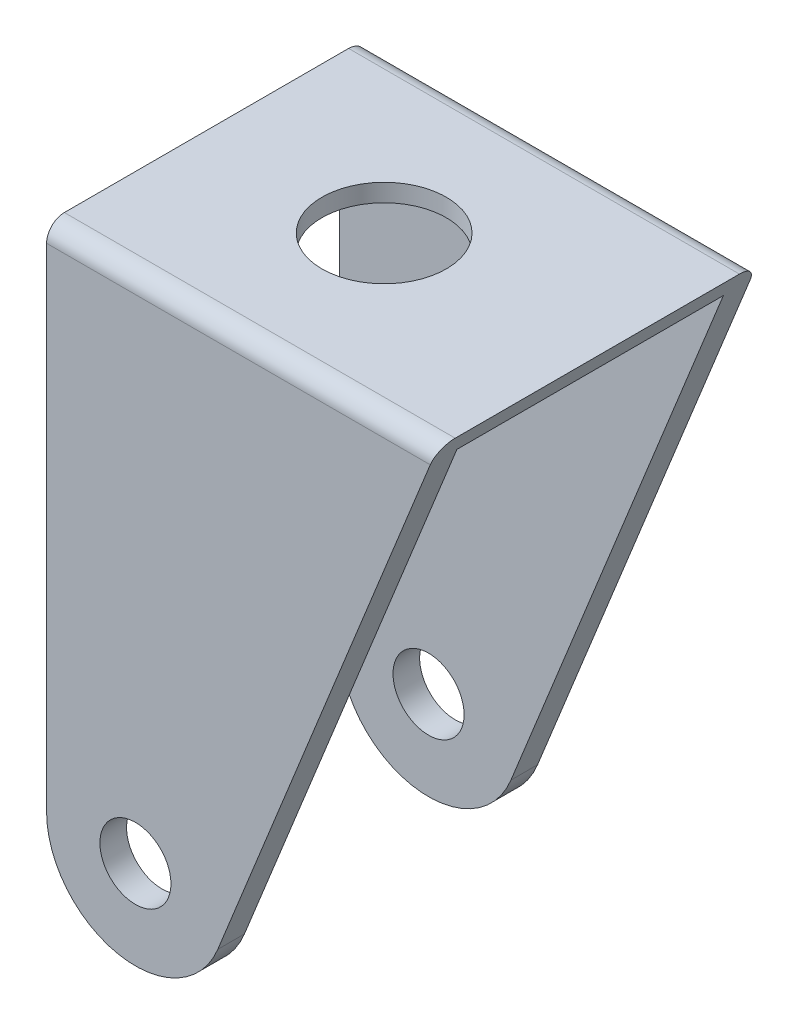
ISO-10303-21;
HEADER;
FILE_DESCRIPTION(('STEP AP214'),'2;1');
FILE_NAME('part.step','',(''),(''),'','','');
FILE_SCHEMA(('AUTOMOTIVE_DESIGN { 1 0 10303 214 1 1 1 1 }'));
ENDSEC;
DATA;
#1=APPLICATION_CONTEXT('core data for automotive mechanical design processes');
#2=APPLICATION_PROTOCOL_DEFINITION('international standard','automotive_design',2000,#1);
#3=PRODUCT_CONTEXT('',#1,'mechanical');
#4=PRODUCT('Part','Part','',(#3));
#5=PRODUCT_RELATED_PRODUCT_CATEGORY('part','',(#4));
#6=PRODUCT_DEFINITION_FORMATION('','',#4);
#7=PRODUCT_DEFINITION_CONTEXT('part definition',#1,'design');
#8=PRODUCT_DEFINITION('design','',#6,#7);
#9=PRODUCT_DEFINITION_SHAPE('','',#8);
#10=(LENGTH_UNIT() NAMED_UNIT(*) SI_UNIT(.MILLI.,.METRE.));
#11=(NAMED_UNIT(*) PLANE_ANGLE_UNIT() SI_UNIT($,.RADIAN.));
#12=(NAMED_UNIT(*) SI_UNIT($,.STERADIAN.) SOLID_ANGLE_UNIT());
#13=UNCERTAINTY_MEASURE_WITH_UNIT(LENGTH_MEASURE(1.E-05),#10,'distance_accuracy_value','');
#14=(GEOMETRIC_REPRESENTATION_CONTEXT(3) GLOBAL_UNCERTAINTY_ASSIGNED_CONTEXT((#13)) GLOBAL_UNIT_ASSIGNED_CONTEXT((#10,
#11,#12)) REPRESENTATION_CONTEXT('',''));
#15=CARTESIAN_POINT('',(0.,0.,0.));
#16=DIRECTION('',(0.,0.,1.));
#17=DIRECTION('',(1.,0.,0.));
#18=AXIS2_PLACEMENT_3D('',#15,#16,#17);
#19=CARTESIAN_POINT('',(-22.,34.9431156058949,18.));
#20=DIRECTION('',(0.,-1.,0.));
#21=DIRECTION('',(0.,0.,-1.));
#22=AXIS2_PLACEMENT_3D('',#19,#20,#21);
#23=PLANE('',#22);
#24=DIRECTION('',(0.,0.,-1.));
#25=VECTOR('',#24,1.);
#26=CARTESIAN_POINT('',(-22.,34.9431156058949,18.));
#27=LINE('',#26,#25);
#28=CARTESIAN_POINT('',(-22.,34.9431156058949,16.));
#29=VERTEX_POINT('',#28);
#30=CARTESIAN_POINT('',(-22.,34.9431156058949,-16.));
#31=VERTEX_POINT('',#30);
#32=EDGE_CURVE('E141',#29,#31,#27,.T.);
#33=ORIENTED_EDGE('',*,*,#32,.F.);
#34=DIRECTION('',(-1.,0.,0.));
#35=VECTOR('',#34,1.);
#36=CARTESIAN_POINT('',(-22.,34.9431156058949,16.));
#37=LINE('',#36,#35);
#38=CARTESIAN_POINT('',(22.,34.9431156058949,16.));
#39=VERTEX_POINT('',#38);
#40=EDGE_CURVE('E166',#29,#39,#37,.F.);
#41=ORIENTED_EDGE('',*,*,#40,.T.);
#42=DIRECTION('',(0.,0.,-1.));
#43=VECTOR('',#42,1.);
#44=CARTESIAN_POINT('',(22.,34.9431156058949,18.));
#45=LINE('',#44,#43);
#46=CARTESIAN_POINT('',(22.,34.9431156058949,-16.));
#47=VERTEX_POINT('',#46);
#48=EDGE_CURVE('E137',#39,#47,#45,.T.);
#49=ORIENTED_EDGE('',*,*,#48,.T.);
#50=DIRECTION('',(-1.,0.,0.));
#51=VECTOR('',#50,1.);
#52=CARTESIAN_POINT('',(-22.,34.9431156058949,-16.));
#53=LINE('',#52,#51);
#54=EDGE_CURVE('E163',#47,#31,#53,.T.);
#55=ORIENTED_EDGE('',*,*,#54,.T.);
#56=EDGE_LOOP('',(#33,#41,#49,#55));
#57=FACE_BOUND('',#56,.T.);
#58=CARTESIAN_POINT('',(-2.,34.9431156058949,0.));
#59=DIRECTION('',(0.,1.,0.));
#60=DIRECTION('',(0.,0.,1.));
#61=AXIS2_PLACEMENT_3D('',#58,#59,#60);
#62=CIRCLE('',#61,6.99999999999999);
#63=CARTESIAN_POINT('',(-2.,34.9431156058949,6.99999999999999));
#64=VERTEX_POINT('',#63);
#65=EDGE_CURVE('E223',#64,#64,#62,.T.);
#66=ORIENTED_EDGE('',*,*,#65,.F.);
#67=EDGE_LOOP('',(#66));
#68=FACE_BOUND('',#67,.T.);
#69=ADVANCED_FACE('F33',(#57,#68),#23,.F.);
#70=CARTESIAN_POINT('',(-22.,-22.5151657847201,18.));
#71=DIRECTION('',(1.,0.,0.));
#72=DIRECTION('',(0.,0.,-1.));
#73=AXIS2_PLACEMENT_3D('',#70,#71,#72);
#74=PLANE('',#73);
#75=DIRECTION('',(0.,-1.,0.));
#76=VECTOR('',#75,1.);
#77=CARTESIAN_POINT('',(-22.,-22.5151657847201,18.));
#78=LINE('',#77,#76);
#79=CARTESIAN_POINT('',(-22.,32.9431156058949,18.));
#80=VERTEX_POINT('',#79);
#81=CARTESIAN_POINT('',(-22.,-22.5151657847201,18.));
#82=VERTEX_POINT('',#81);
#83=EDGE_CURVE('E189',#80,#82,#78,.T.);
#84=ORIENTED_EDGE('',*,*,#83,.F.);
#85=CARTESIAN_POINT('',(-22.,32.9431156058949,16.));
#86=DIRECTION('',(1.,0.,0.));
#87=DIRECTION('',(0.,0.,-1.));
#88=AXIS2_PLACEMENT_3D('',#85,#86,#87);
#89=CIRCLE('',#88,2.);
#90=EDGE_CURVE('E161',#80,#29,#89,.F.);
#91=ORIENTED_EDGE('',*,*,#90,.T.);
#92=ORIENTED_EDGE('',*,*,#32,.T.);
#93=CARTESIAN_POINT('',(-22.,32.9431156058949,-16.));
#94=DIRECTION('',(1.,0.,0.));
#95=DIRECTION('',(0.,0.,-1.));
#96=AXIS2_PLACEMENT_3D('',#93,#94,#95);
#97=CIRCLE('',#96,2.);
#98=CARTESIAN_POINT('',(-22.,32.9431156058949,-18.));
#99=VERTEX_POINT('',#98);
#100=EDGE_CURVE('E159',#31,#99,#97,.F.);
#101=ORIENTED_EDGE('',*,*,#100,.T.);
#102=DIRECTION('',(0.,-1.,0.));
#103=VECTOR('',#102,1.);
#104=CARTESIAN_POINT('',(-22.,-22.5151657847201,-18.));
#105=LINE('',#104,#103);
#106=CARTESIAN_POINT('',(-22.,-22.5151657847201,-18.));
#107=VERTEX_POINT('',#106);
#108=EDGE_CURVE('E197',#99,#107,#105,.T.);
#109=ORIENTED_EDGE('',*,*,#108,.T.);
#110=DIRECTION('',(0.,0.,-1.));
#111=VECTOR('',#110,1.);
#112=CARTESIAN_POINT('',(-22.,-22.5151657847201,18.));
#113=LINE('',#112,#111);
#114=CARTESIAN_POINT('',(-22.,-22.5151657847201,-15.));
#115=VERTEX_POINT('',#114);
#116=EDGE_CURVE('E140',#115,#107,#113,.T.);
#117=ORIENTED_EDGE('',*,*,#116,.F.);
#118=DIRECTION('',(0.,-1.,0.));
#119=VECTOR('',#118,1.);
#120=CARTESIAN_POINT('',(-22.,32.9431156058949,-15.));
#121=LINE('',#120,#119);
#122=CARTESIAN_POINT('',(-22.,32.9431156058949,-15.));
#123=VERTEX_POINT('',#122);
#124=EDGE_CURVE('E118',#123,#115,#121,.T.);
#125=ORIENTED_EDGE('',*,*,#124,.F.);
#126=DIRECTION('',(0.,0.,1.));
#127=VECTOR('',#126,1.);
#128=CARTESIAN_POINT('',(-22.,32.9431156058949,-15.));
#129=LINE('',#128,#127);
#130=CARTESIAN_POINT('',(-22.,32.9431156058949,15.));
#131=VERTEX_POINT('',#130);
#132=EDGE_CURVE('E153',#123,#131,#129,.T.);
#133=ORIENTED_EDGE('',*,*,#132,.T.);
#134=DIRECTION('',(0.,-1.,0.));
#135=VECTOR('',#134,1.);
#136=CARTESIAN_POINT('',(-22.,32.9431156058949,15.));
#137=LINE('',#136,#135);
#138=CARTESIAN_POINT('',(-22.,-22.5151657847201,15.));
#139=VERTEX_POINT('',#138);
#140=EDGE_CURVE('E123',#131,#139,#137,.T.);
#141=ORIENTED_EDGE('',*,*,#140,.T.);
#142=EDGE_CURVE('E145',#82,#139,#113,.T.);
#143=ORIENTED_EDGE('',*,*,#142,.F.);
#144=EDGE_LOOP('',(#84,#91,#92,#101,#109,#117,#125,#133,#141,#143));
#145=FACE_BOUND('',#144,.T.);
#146=ADVANCED_FACE('F187',(#145),#74,.F.);
#147=CARTESIAN_POINT('',(-12.,-22.5151657847201,18.));
#148=DIRECTION('',(0.,0.,-1.));
#149=DIRECTION('',(-1.,0.,0.));
#150=AXIS2_PLACEMENT_3D('',#147,#148,#149);
#151=CYLINDRICAL_SURFACE('',#150,10.);
#152=CARTESIAN_POINT('',(-12.,-22.5151657847201,-15.));
#153=DIRECTION('',(0.,0.,1.));
#154=DIRECTION('',(1.,0.,0.));
#155=AXIS2_PLACEMENT_3D('',#152,#153,#154);
#156=CIRCLE('',#155,10.);
#157=CARTESIAN_POINT('',(-2.7281614543321,-26.2612317188791,-15.));
#158=VERTEX_POINT('',#157);
#159=EDGE_CURVE('E111',#115,#158,#156,.T.);
#160=ORIENTED_EDGE('',*,*,#159,.F.);
#161=ORIENTED_EDGE('',*,*,#116,.T.);
#162=CARTESIAN_POINT('',(-12.,-22.5151657847201,-18.));
#163=DIRECTION('',(0.,0.,1.));
#164=DIRECTION('',(-1.,0.,0.));
#165=AXIS2_PLACEMENT_3D('',#162,#163,#164);
#166=CIRCLE('',#165,10.);
#167=CARTESIAN_POINT('',(-2.7281614543321,-26.2612317188791,-18.));
#168=VERTEX_POINT('',#167);
#169=EDGE_CURVE('E135',#107,#168,#166,.T.);
#170=ORIENTED_EDGE('',*,*,#169,.T.);
#171=DIRECTION('',(0.,0.,-1.));
#172=VECTOR('',#171,1.);
#173=CARTESIAN_POINT('',(-2.7281614543321,-26.2612317188791,18.));
#174=LINE('',#173,#172);
#175=EDGE_CURVE('E126',#158,#168,#174,.T.);
#176=ORIENTED_EDGE('',*,*,#175,.F.);
#177=EDGE_LOOP('',(#160,#161,#170,#176));
#178=FACE_BOUND('',#177,.T.);
#179=ADVANCED_FACE('F133',(#178),#151,.T.);
#180=CARTESIAN_POINT('',(22.,34.9431156058949,18.));
#181=DIRECTION('',(-0.92718385456679,0.374606593415906,0.));
#182=DIRECTION('',(-0.374606593415906,-0.92718385456679,0.));
#183=AXIS2_PLACEMENT_3D('',#180,#181,#182);
#184=PLANE('',#183);
#185=ORIENTED_EDGE('',*,*,#48,.F.);
#186=CARTESIAN_POINT('',(21.1919475483297,32.9431156058949,16.));
#187=DIRECTION('',(-0.92718385456679,0.374606593415906,0.));
#188=DIRECTION('',(-0.374606593415906,-0.92718385456679,0.));
#189=AXIS2_PLACEMENT_3D('',#186,#187,#188);
#190=ELLIPSE('',#189,2.15706948535516,2.);
#191=CARTESIAN_POINT('',(21.1919475483297,32.9431156058949,18.));
#192=VERTEX_POINT('',#191);
#193=EDGE_CURVE('E41',#39,#192,#190,.F.);
#194=ORIENTED_EDGE('',*,*,#193,.T.);
#195=DIRECTION('',(0.374606593415906,0.92718385456679,0.));
#196=VECTOR('',#195,1.);
#197=CARTESIAN_POINT('',(22.,34.9431156058949,18.));
#198=LINE('',#197,#196);
#199=CARTESIAN_POINT('',(-2.7281614543321,-26.2612317188791,18.));
#200=VERTEX_POINT('',#199);
#201=EDGE_CURVE('E171',#200,#192,#198,.T.);
#202=ORIENTED_EDGE('',*,*,#201,.F.);
#203=CARTESIAN_POINT('',(-2.7281614543321,-26.2612317188791,15.));
#204=VERTEX_POINT('',#203);
#205=EDGE_CURVE('E136',#200,#204,#174,.T.);
#206=ORIENTED_EDGE('',*,*,#205,.T.);
#207=DIRECTION('',(0.374606593415906,0.92718385456679,0.));
#208=VECTOR('',#207,1.);
#209=CARTESIAN_POINT('',(-2.7281614543321,-26.2612317188791,15.));
#210=LINE('',#209,#208);
#211=CARTESIAN_POINT('',(21.1919475483297,32.9431156058949,15.));
#212=VERTEX_POINT('',#211);
#213=EDGE_CURVE('E213',#204,#212,#210,.T.);
#214=ORIENTED_EDGE('',*,*,#213,.T.);
#215=DIRECTION('',(0.,0.,1.));
#216=VECTOR('',#215,1.);
#217=CARTESIAN_POINT('',(21.1919475483297,32.9431156058949,-15.));
#218=LINE('',#217,#216);
#219=CARTESIAN_POINT('',(21.1919475483297,32.9431156058949,-15.));
#220=VERTEX_POINT('',#219);
#221=EDGE_CURVE('E130',#220,#212,#218,.T.);
#222=ORIENTED_EDGE('',*,*,#221,.F.);
#223=DIRECTION('',(0.374606593415906,0.92718385456679,0.));
#224=VECTOR('',#223,1.);
#225=CARTESIAN_POINT('',(-2.7281614543321,-26.2612317188791,-15.));
#226=LINE('',#225,#224);
#227=EDGE_CURVE('E115',#158,#220,#226,.T.);
#228=ORIENTED_EDGE('',*,*,#227,.F.);
#229=ORIENTED_EDGE('',*,*,#175,.T.);
#230=DIRECTION('',(0.374606593415906,0.92718385456679,0.));
#231=VECTOR('',#230,1.);
#232=CARTESIAN_POINT('',(22.,34.9431156058949,-18.));
#233=LINE('',#232,#231);
#234=CARTESIAN_POINT('',(21.1919475483297,32.9431156058949,-18.));
#235=VERTEX_POINT('',#234);
#236=EDGE_CURVE('E194',#168,#235,#233,.T.);
#237=ORIENTED_EDGE('',*,*,#236,.T.);
#238=CARTESIAN_POINT('',(21.1919475483297,32.9431156058949,-16.));
#239=DIRECTION('',(-0.92718385456679,0.374606593415906,0.));
#240=DIRECTION('',(0.374606593415906,0.92718385456679,0.));
#241=AXIS2_PLACEMENT_3D('',#238,#239,#240);
#242=ELLIPSE('',#241,2.15706948535516,2.);
#243=EDGE_CURVE('E53',#235,#47,#242,.F.);
#244=ORIENTED_EDGE('',*,*,#243,.T.);
#245=EDGE_LOOP('',(#185,#194,#202,#206,#214,#222,#228,#229,#237,#244));
#246=FACE_BOUND('',#245,.T.);
#247=ADVANCED_FACE('F125',(#246),#184,.F.);
#248=CARTESIAN_POINT('',(-12.,-22.5151657847201,18.));
#249=DIRECTION('',(0.,0.,-1.));
#250=DIRECTION('',(-1.,0.,0.));
#251=AXIS2_PLACEMENT_3D('',#248,#249,#250);
#252=CYLINDRICAL_SURFACE('',#251,4.);
#253=CARTESIAN_POINT('',(-12.,-22.5151657847201,-18.));
#254=DIRECTION('',(0.,0.,1.));
#255=DIRECTION('',(1.,0.,0.));
#256=AXIS2_PLACEMENT_3D('',#253,#254,#255);
#257=CIRCLE('',#256,4.);
#258=CARTESIAN_POINT('',(-8.,-22.5151657847201,-18.));
#259=VERTEX_POINT('',#258);
#260=EDGE_CURVE('E156',#259,#259,#257,.T.);
#261=ORIENTED_EDGE('',*,*,#260,.F.);
#262=EDGE_LOOP('',(#261));
#263=FACE_BOUND('',#262,.T.);
#264=CARTESIAN_POINT('',(-12.,-22.5151657847201,-15.));
#265=DIRECTION('',(0.,0.,1.));
#266=DIRECTION('',(1.,0.,0.));
#267=AXIS2_PLACEMENT_3D('',#264,#265,#266);
#268=CIRCLE('',#267,4.);
#269=CARTESIAN_POINT('',(-8.,-22.5151657847201,-15.));
#270=VERTEX_POINT('',#269);
#271=EDGE_CURVE('E152',#270,#270,#268,.T.);
#272=ORIENTED_EDGE('',*,*,#271,.T.);
#273=EDGE_LOOP('',(#272));
#274=FACE_BOUND('',#273,.T.);
#275=ADVANCED_FACE('F240',(#263,#274),#252,.F.);
#276=CARTESIAN_POINT('',(-12.,-22.5151657847201,18.));
#277=DIRECTION('',(0.,0.,-1.));
#278=DIRECTION('',(-1.,0.,0.));
#279=AXIS2_PLACEMENT_3D('',#276,#277,#278);
#280=PLANE('',#279);
#281=ORIENTED_EDGE('',*,*,#201,.T.);
#282=DIRECTION('',(-1.,0.,0.));
#283=VECTOR('',#282,1.);
#284=CARTESIAN_POINT('',(-12.,32.9431156058949,18.));
#285=LINE('',#284,#283);
#286=EDGE_CURVE('E148',#192,#80,#285,.T.);
#287=ORIENTED_EDGE('',*,*,#286,.T.);
#288=ORIENTED_EDGE('',*,*,#83,.T.);
#289=CARTESIAN_POINT('',(-12.,-22.5151657847201,18.));
#290=DIRECTION('',(0.,0.,1.));
#291=DIRECTION('',(-1.,0.,0.));
#292=AXIS2_PLACEMENT_3D('',#289,#290,#291);
#293=CIRCLE('',#292,10.);
#294=EDGE_CURVE('E180',#82,#200,#293,.T.);
#295=ORIENTED_EDGE('',*,*,#294,.T.);
#296=EDGE_LOOP('',(#281,#287,#288,#295));
#297=FACE_BOUND('',#296,.T.);
#298=CARTESIAN_POINT('',(-12.,-22.5151657847201,18.));
#299=DIRECTION('',(0.,0.,1.));
#300=DIRECTION('',(1.,0.,0.));
#301=AXIS2_PLACEMENT_3D('',#298,#299,#300);
#302=CIRCLE('',#301,4.);
#303=CARTESIAN_POINT('',(-8.,-22.5151657847201,18.));
#304=VERTEX_POINT('',#303);
#305=EDGE_CURVE('E198',#304,#304,#302,.T.);
#306=ORIENTED_EDGE('',*,*,#305,.F.);
#307=EDGE_LOOP('',(#306));
#308=FACE_BOUND('',#307,.T.);
#309=ADVANCED_FACE('F176',(#297,#308),#280,.F.);
#310=CARTESIAN_POINT('',(-12.,-22.5151657847201,-18.));
#311=DIRECTION('',(0.,0.,-1.));
#312=DIRECTION('',(-1.,0.,0.));
#313=AXIS2_PLACEMENT_3D('',#310,#311,#312);
#314=PLANE('',#313);
#315=ORIENTED_EDGE('',*,*,#108,.F.);
#316=DIRECTION('',(-1.,0.,0.));
#317=VECTOR('',#316,1.);
#318=CARTESIAN_POINT('',(22.,32.9431156058949,-18.));
#319=LINE('',#318,#317);
#320=EDGE_CURVE('E11',#99,#235,#319,.F.);
#321=ORIENTED_EDGE('',*,*,#320,.T.);
#322=ORIENTED_EDGE('',*,*,#236,.F.);
#323=ORIENTED_EDGE('',*,*,#169,.F.);
#324=EDGE_LOOP('',(#315,#321,#322,#323));
#325=FACE_BOUND('',#324,.T.);
#326=ORIENTED_EDGE('',*,*,#260,.T.);
#327=EDGE_LOOP('',(#326));
#328=FACE_BOUND('',#327,.T.);
#329=ADVANCED_FACE('F236',(#325,#328),#314,.T.);
#330=ORIENTED_EDGE('',*,*,#142,.T.);
#331=CARTESIAN_POINT('',(-12.,-22.5151657847201,15.));
#332=DIRECTION('',(0.,0.,1.));
#333=DIRECTION('',(1.,0.,0.));
#334=AXIS2_PLACEMENT_3D('',#331,#332,#333);
#335=CIRCLE('',#334,10.);
#336=EDGE_CURVE('E215',#139,#204,#335,.T.);
#337=ORIENTED_EDGE('',*,*,#336,.T.);
#338=ORIENTED_EDGE('',*,*,#205,.F.);
#339=ORIENTED_EDGE('',*,*,#294,.F.);
#340=EDGE_LOOP('',(#330,#337,#338,#339));
#341=FACE_BOUND('',#340,.T.);
#342=ADVANCED_FACE('F241',(#341),#151,.T.);
#343=CARTESIAN_POINT('',(-12.,-22.5151657847201,15.));
#344=DIRECTION('',(0.,0.,1.));
#345=DIRECTION('',(1.,0.,0.));
#346=AXIS2_PLACEMENT_3D('',#343,#344,#345);
#347=CIRCLE('',#346,4.);
#348=CARTESIAN_POINT('',(-8.,-22.5151657847201,15.));
#349=VERTEX_POINT('',#348);
#350=EDGE_CURVE('E149',#349,#349,#347,.T.);
#351=ORIENTED_EDGE('',*,*,#350,.F.);
#352=EDGE_LOOP('',(#351));
#353=FACE_BOUND('',#352,.T.);
#354=ORIENTED_EDGE('',*,*,#305,.T.);
#355=EDGE_LOOP('',(#354));
#356=FACE_BOUND('',#355,.T.);
#357=ADVANCED_FACE('F243',(#353,#356),#252,.F.);
#358=CARTESIAN_POINT('',(-22.,32.9431156058949,-15.));
#359=DIRECTION('',(0.,1.,0.));
#360=DIRECTION('',(0.,0.,1.));
#361=AXIS2_PLACEMENT_3D('',#358,#359,#360);
#362=PLANE('',#361);
#363=CARTESIAN_POINT('',(-2.,32.9431156058949,0.));
#364=DIRECTION('',(0.,1.,0.));
#365=DIRECTION('',(0.,0.,1.));
#366=AXIS2_PLACEMENT_3D('',#363,#364,#365);
#367=CIRCLE('',#366,6.99999999999999);
#368=CARTESIAN_POINT('',(-2.,32.9431156058949,6.99999999999999));
#369=VERTEX_POINT('',#368);
#370=EDGE_CURVE('E218',#369,#369,#367,.T.);
#371=ORIENTED_EDGE('',*,*,#370,.T.);
#372=EDGE_LOOP('',(#371));
#373=FACE_BOUND('',#372,.T.);
#374=DIRECTION('',(-1.,0.,0.));
#375=VECTOR('',#374,1.);
#376=CARTESIAN_POINT('',(-22.,32.9431156058949,15.));
#377=LINE('',#376,#375);
#378=EDGE_CURVE('E211',#212,#131,#377,.T.);
#379=ORIENTED_EDGE('',*,*,#378,.T.);
#380=ORIENTED_EDGE('',*,*,#132,.F.);
#381=DIRECTION('',(-1.,0.,0.));
#382=VECTOR('',#381,1.);
#383=CARTESIAN_POINT('',(-22.,32.9431156058949,-15.));
#384=LINE('',#383,#382);
#385=EDGE_CURVE('E131',#220,#123,#384,.T.);
#386=ORIENTED_EDGE('',*,*,#385,.F.);
#387=ORIENTED_EDGE('',*,*,#221,.T.);
#388=EDGE_LOOP('',(#379,#380,#386,#387));
#389=FACE_BOUND('',#388,.T.);
#390=ADVANCED_FACE('F262',(#373,#389),#362,.F.);
#391=CARTESIAN_POINT('',(-12.,-22.5151657847201,-15.));
#392=DIRECTION('',(0.,0.,1.));
#393=DIRECTION('',(1.,0.,0.));
#394=AXIS2_PLACEMENT_3D('',#391,#392,#393);
#395=PLANE('',#394);
#396=ORIENTED_EDGE('',*,*,#271,.F.);
#397=EDGE_LOOP('',(#396));
#398=FACE_BOUND('',#397,.T.);
#399=ORIENTED_EDGE('',*,*,#159,.T.);
#400=ORIENTED_EDGE('',*,*,#227,.T.);
#401=ORIENTED_EDGE('',*,*,#385,.T.);
#402=ORIENTED_EDGE('',*,*,#124,.T.);
#403=EDGE_LOOP('',(#399,#400,#401,#402));
#404=FACE_BOUND('',#403,.T.);
#405=ADVANCED_FACE('F113',(#398,#404),#395,.T.);
#406=CARTESIAN_POINT('',(-12.,-22.5151657847201,15.));
#407=DIRECTION('',(0.,0.,1.));
#408=DIRECTION('',(1.,0.,0.));
#409=AXIS2_PLACEMENT_3D('',#406,#407,#408);
#410=PLANE('',#409);
#411=ORIENTED_EDGE('',*,*,#350,.T.);
#412=EDGE_LOOP('',(#411));
#413=FACE_BOUND('',#412,.T.);
#414=ORIENTED_EDGE('',*,*,#336,.F.);
#415=ORIENTED_EDGE('',*,*,#140,.F.);
#416=ORIENTED_EDGE('',*,*,#378,.F.);
#417=ORIENTED_EDGE('',*,*,#213,.F.);
#418=EDGE_LOOP('',(#414,#415,#416,#417));
#419=FACE_BOUND('',#418,.T.);
#420=ADVANCED_FACE('F251',(#413,#419),#410,.F.);
#421=CARTESIAN_POINT('',(-2.,34.9431156058949,0.));
#422=DIRECTION('',(0.,1.,0.));
#423=DIRECTION('',(0.,0.,1.));
#424=AXIS2_PLACEMENT_3D('',#421,#422,#423);
#425=CYLINDRICAL_SURFACE('',#424,6.99999999999999);
#426=ORIENTED_EDGE('',*,*,#370,.F.);
#427=EDGE_LOOP('',(#426));
#428=FACE_BOUND('',#427,.T.);
#429=ORIENTED_EDGE('',*,*,#65,.T.);
#430=EDGE_LOOP('',(#429));
#431=FACE_BOUND('',#430,.T.);
#432=ADVANCED_FACE('F227',(#428,#431),#425,.F.);
#433=CARTESIAN_POINT('',(-12.,32.9431156058949,16.));
#434=DIRECTION('',(-1.,0.,0.));
#435=DIRECTION('',(0.,0.,1.));
#436=AXIS2_PLACEMENT_3D('',#433,#434,#435);
#437=CYLINDRICAL_SURFACE('',#436,2.);
#438=ORIENTED_EDGE('',*,*,#193,.F.);
#439=ORIENTED_EDGE('',*,*,#40,.F.);
#440=ORIENTED_EDGE('',*,*,#90,.F.);
#441=ORIENTED_EDGE('',*,*,#286,.F.);
#442=EDGE_LOOP('',(#438,#439,#440,#441));
#443=FACE_BOUND('',#442,.T.);
#444=ADVANCED_FACE('F183',(#443),#437,.T.);
#445=CARTESIAN_POINT('',(-22.,32.9431156058949,-16.));
#446=DIRECTION('',(1.,0.,0.));
#447=DIRECTION('',(0.,0.,-1.));
#448=AXIS2_PLACEMENT_3D('',#445,#446,#447);
#449=CYLINDRICAL_SURFACE('',#448,2.);
#450=ORIENTED_EDGE('',*,*,#243,.F.);
#451=ORIENTED_EDGE('',*,*,#320,.F.);
#452=ORIENTED_EDGE('',*,*,#100,.F.);
#453=ORIENTED_EDGE('',*,*,#54,.F.);
#454=EDGE_LOOP('',(#450,#451,#452,#453));
#455=FACE_BOUND('',#454,.T.);
#456=ADVANCED_FACE('F35',(#455),#449,.T.);
#457=CLOSED_SHELL('',(#69,#146,#179,#247,#275,#309,#329,#342,#357,#390,#405,#420,#432,#444,#456));
#458=MANIFOLD_SOLID_BREP('B2',#457);
#459=ADVANCED_BREP_SHAPE_REPRESENTATION('',(#18,#458),#14);
#460=SHAPE_DEFINITION_REPRESENTATION(#9,#459);
ENDSEC;
END-ISO-10303-21;
